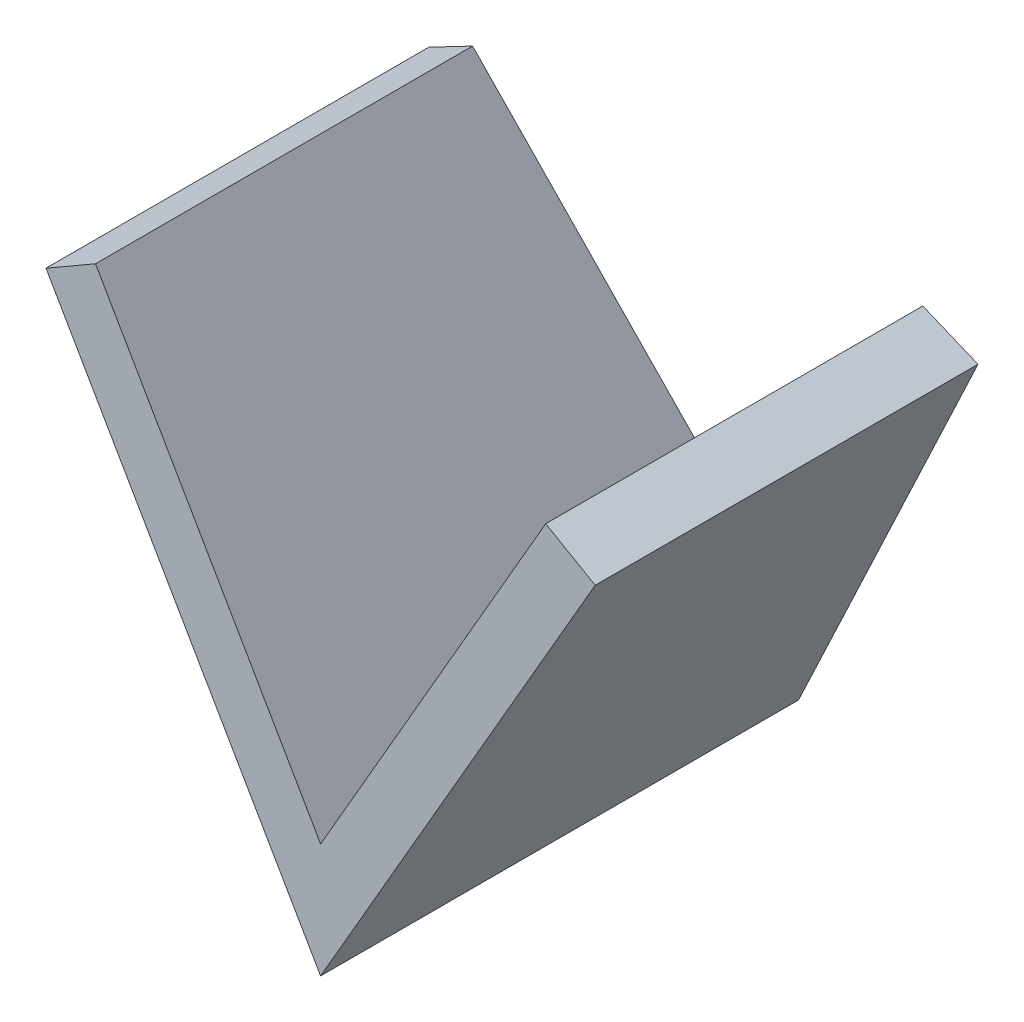
ISO-10303-21;
HEADER;
FILE_DESCRIPTION(('STEP AP214'),'2;1');
FILE_NAME('part.step','',(''),(''),'','','');
FILE_SCHEMA(('AUTOMOTIVE_DESIGN { 1 0 10303 214 1 1 1 1 }'));
ENDSEC;
DATA;
#1=APPLICATION_CONTEXT('core data for automotive mechanical design processes');
#2=APPLICATION_PROTOCOL_DEFINITION('international standard','automotive_design',2000,#1);
#3=PRODUCT_CONTEXT('',#1,'mechanical');
#4=PRODUCT('Part','Part','',(#3));
#5=PRODUCT_RELATED_PRODUCT_CATEGORY('part','',(#4));
#6=PRODUCT_DEFINITION_FORMATION('','',#4);
#7=PRODUCT_DEFINITION_CONTEXT('part definition',#1,'design');
#8=PRODUCT_DEFINITION('design','',#6,#7);
#9=PRODUCT_DEFINITION_SHAPE('','',#8);
#10=(LENGTH_UNIT() NAMED_UNIT(*) SI_UNIT(.MILLI.,.METRE.));
#11=(NAMED_UNIT(*) PLANE_ANGLE_UNIT() SI_UNIT($,.RADIAN.));
#12=(NAMED_UNIT(*) SI_UNIT($,.STERADIAN.) SOLID_ANGLE_UNIT());
#13=UNCERTAINTY_MEASURE_WITH_UNIT(LENGTH_MEASURE(1.E-05),#10,'distance_accuracy_value','');
#14=(GEOMETRIC_REPRESENTATION_CONTEXT(3) GLOBAL_UNCERTAINTY_ASSIGNED_CONTEXT((#13)) GLOBAL_UNIT_ASSIGNED_CONTEXT((#10,
#11,#12)) REPRESENTATION_CONTEXT('',''));
#15=CARTESIAN_POINT('',(0.,0.,0.));
#16=DIRECTION('',(0.,0.,1.));
#17=DIRECTION('',(1.,0.,0.));
#18=AXIS2_PLACEMENT_3D('',#15,#16,#17);
#19=CARTESIAN_POINT('',(-4.78858946785775E-13,-6.56272500000016,-12.5939415069886));
#20=DIRECTION('',(-0.866025403784497,-0.499999999999899,0.));
#21=DIRECTION('',(0.4999999999999,-0.866025403784497,0.));
#22=AXIS2_PLACEMENT_3D('',#19,#20,#21);
#23=PLANE('',#22);
#24=DIRECTION('',(-0.492664639082047,0.853320185982917,0.170664037196584));
#25=VECTOR('',#24,1.);
#26=CARTESIAN_POINT('',(0.630171919784603,-7.65421478257143,-5.31734295651449));
#27=LINE('',#26,#25);
#28=CARTESIAN_POINT('',(-4.78783679369599E-13,-6.56272500000016,-5.09904500000023));
#29=VERTEX_POINT('',#28);
#30=CARTESIAN_POINT('',(-2.92966802247208,-1.48839113576815,-4.08417822715383));
#31=VERTEX_POINT('',#30);
#32=EDGE_CURVE('E41',#29,#31,#27,.T.);
#33=ORIENTED_EDGE('',*,*,#32,.F.);
#34=DIRECTION('',(0.,0.,1.));
#35=VECTOR('',#34,1.);
#36=CARTESIAN_POINT('',(-4.78858946785775E-13,-6.56272500000016,-12.5939415069886));
#37=LINE('',#36,#35);
#38=CARTESIAN_POINT('',(-4.78858946785775E-13,-6.56272500000016,0.));
#39=VERTEX_POINT('',#38);
#40=EDGE_CURVE('E80',#29,#39,#37,.T.);
#41=ORIENTED_EDGE('',*,*,#40,.T.);
#42=DIRECTION('',(0.4999999999999,-0.866025403784497,0.));
#43=VECTOR('',#42,1.);
#44=CARTESIAN_POINT('',(-4.78858946785775E-13,-6.56272500000016,0.));
#45=LINE('',#44,#43);
#46=CARTESIAN_POINT('',(-2.92966802247208,-1.48839113576816,0.));
#47=VERTEX_POINT('',#46);
#48=EDGE_CURVE('E84',#47,#39,#45,.T.);
#49=ORIENTED_EDGE('',*,*,#48,.F.);
#50=DIRECTION('',(0.,0.,1.));
#51=VECTOR('',#50,1.);
#52=CARTESIAN_POINT('',(-2.92966802247208,-1.48839113576816,-12.5939415069886));
#53=LINE('',#52,#51);
#54=EDGE_CURVE('E114',#31,#47,#53,.T.);
#55=ORIENTED_EDGE('',*,*,#54,.F.);
#56=EDGE_LOOP('',(#33,#41,#49,#55));
#57=FACE_BOUND('',#56,.T.);
#58=ADVANCED_FACE('F33',(#57),#23,.T.);
#59=CARTESIAN_POINT('',(-2.92966802247208,-1.48839113576816,-12.5939415069886));
#60=DIRECTION('',(-0.500000000000007,0.866025403784435,0.));
#61=DIRECTION('',(-0.866025403784435,-0.500000000000007,0.));
#62=AXIS2_PLACEMENT_3D('',#59,#60,#61);
#63=PLANE('',#62);
#64=DIRECTION('',(0.861727484432135,0.497518595105002,0.0995037190209979));
#65=VECTOR('',#64,1.);
#66=CARTESIAN_POINT('',(-3.65933843638582,-1.90966654566097,-4.16843330913239));
#67=LINE('',#66,#65);
#68=CARTESIAN_POINT('',(-2.40173893632545,-1.18359113576836,-4.02321822715387));
#69=VERTEX_POINT('',#68);
#70=EDGE_CURVE('E136',#31,#69,#67,.T.);
#71=ORIENTED_EDGE('',*,*,#70,.F.);
#72=ORIENTED_EDGE('',*,*,#54,.T.);
#73=DIRECTION('',(-0.866025403784435,-0.500000000000007,0.));
#74=VECTOR('',#73,1.);
#75=CARTESIAN_POINT('',(-2.92966802247208,-1.48839113576816,0.));
#76=LINE('',#75,#74);
#77=CARTESIAN_POINT('',(-2.40173893632545,-1.18359113576836,0.));
#78=VERTEX_POINT('',#77);
#79=EDGE_CURVE('E90',#78,#47,#76,.T.);
#80=ORIENTED_EDGE('',*,*,#79,.F.);
#81=DIRECTION('',(0.,0.,1.));
#82=VECTOR('',#81,1.);
#83=CARTESIAN_POINT('',(-2.40173893632545,-1.18359113576836,-12.5939415069886));
#84=LINE('',#83,#82);
#85=EDGE_CURVE('E117',#69,#78,#84,.T.);
#86=ORIENTED_EDGE('',*,*,#85,.F.);
#87=EDGE_LOOP('',(#71,#72,#80,#86));
#88=FACE_BOUND('',#87,.T.);
#89=ADVANCED_FACE('F135',(#88),#63,.T.);
#90=CARTESIAN_POINT('',(-2.40173893632545,-1.18359113576836,-12.5939415069886));
#91=DIRECTION('',(0.866025403784461,0.499999999999962,0.));
#92=DIRECTION('',(-0.499999999999962,0.866025403784461,0.));
#93=AXIS2_PLACEMENT_3D('',#90,#91,#92);
#94=PLANE('',#93);
#95=DIRECTION('',(0.492664639082108,-0.853320185982883,-0.170664037196577));
#96=VECTOR('',#95,1.);
#97=CARTESIAN_POINT('',(-1.68111135485523,-2.43175472021038,-4.27285094404228));
#98=LINE('',#97,#96);
#99=CARTESIAN_POINT('',(3.45437654175607E-12,-5.34352500000687,-4.85520500000158));
#100=VERTEX_POINT('',#99);
#101=EDGE_CURVE('E139',#69,#100,#98,.T.);
#102=ORIENTED_EDGE('',*,*,#101,.F.);
#103=ORIENTED_EDGE('',*,*,#85,.T.);
#104=DIRECTION('',(-0.499999999999962,0.866025403784461,0.));
#105=VECTOR('',#104,1.);
#106=CARTESIAN_POINT('',(-2.40173893632545,-1.18359113576836,0.));
#107=LINE('',#106,#105);
#108=CARTESIAN_POINT('',(3.45450713704479E-12,-5.34352500000687,0.));
#109=VERTEX_POINT('',#108);
#110=EDGE_CURVE('E111',#109,#78,#107,.T.);
#111=ORIENTED_EDGE('',*,*,#110,.F.);
#112=DIRECTION('',(0.,0.,1.));
#113=VECTOR('',#112,1.);
#114=CARTESIAN_POINT('',(3.45450713704479E-12,-5.34352500000687,-12.5939415069886));
#115=LINE('',#114,#113);
#116=EDGE_CURVE('E119',#100,#109,#115,.T.);
#117=ORIENTED_EDGE('',*,*,#116,.F.);
#118=EDGE_LOOP('',(#102,#103,#111,#117));
#119=FACE_BOUND('',#118,.T.);
#120=ADVANCED_FACE('F143',(#119),#94,.T.);
#121=CARTESIAN_POINT('',(3.45450713704479E-12,-5.34352500000687,-12.5939415069886));
#122=DIRECTION('',(-0.866025403785136,0.499999999998792,0.));
#123=DIRECTION('',(-0.499999999998792,-0.866025403785136,0.));
#124=AXIS2_PLACEMENT_3D('',#121,#122,#123);
#125=PLANE('',#124);
#126=DIRECTION('',(0.492664639080945,0.853320185983529,0.170664037196704));
#127=VECTOR('',#126,1.);
#128=CARTESIAN_POINT('',(-0.650674020213407,-6.4705254621912,-5.08060509243844));
#129=LINE('',#128,#127);
#130=CARTESIAN_POINT('',(2.40173893632476,-1.18359113576854,-4.02321822715392));
#131=VERTEX_POINT('',#130);
#132=EDGE_CURVE('E48',#100,#131,#129,.T.);
#133=ORIENTED_EDGE('',*,*,#132,.F.);
#134=ORIENTED_EDGE('',*,*,#116,.T.);
#135=DIRECTION('',(-0.499999999998792,-0.866025403785136,0.));
#136=VECTOR('',#135,1.);
#137=CARTESIAN_POINT('',(3.45450713704479E-12,-5.34352500000687,0.));
#138=LINE('',#137,#136);
#139=CARTESIAN_POINT('',(2.40173893632476,-1.18359113576854,0.));
#140=VERTEX_POINT('',#139);
#141=EDGE_CURVE('E108',#140,#109,#138,.T.);
#142=ORIENTED_EDGE('',*,*,#141,.F.);
#143=DIRECTION('',(0.,0.,1.));
#144=VECTOR('',#143,1.);
#145=CARTESIAN_POINT('',(2.40173893632476,-1.18359113576854,-12.5939415069886));
#146=LINE('',#145,#144);
#147=EDGE_CURVE('E121',#131,#140,#146,.T.);
#148=ORIENTED_EDGE('',*,*,#147,.F.);
#149=EDGE_LOOP('',(#133,#134,#142,#148));
#150=FACE_BOUND('',#149,.T.);
#151=ADVANCED_FACE('F128',(#150),#125,.T.);
#152=CARTESIAN_POINT('',(2.40173893632476,-1.18359113576854,-12.5939415069886));
#153=DIRECTION('',(0.499999999999937,0.866025403784475,0.));
#154=DIRECTION('',(-0.866025403784475,0.499999999999937,0.));
#155=AXIS2_PLACEMENT_3D('',#152,#153,#154);
#156=PLANE('',#155);
#157=DIRECTION('',(0.861727484432176,-0.497518595104932,-0.0995037190209881));
#158=VECTOR('',#157,1.);
#159=CARTESIAN_POINT('',(3.13663637089338,-1.60788436744343,-4.1080768734889));
#160=LINE('',#159,#158);
#161=CARTESIAN_POINT('',(2.92966802247168,-1.48839113576844,-4.0841782271539));
#162=VERTEX_POINT('',#161);
#163=EDGE_CURVE('E116',#131,#162,#160,.T.);
#164=ORIENTED_EDGE('',*,*,#163,.F.);
#165=ORIENTED_EDGE('',*,*,#147,.T.);
#166=DIRECTION('',(-0.866025403784475,0.499999999999937,0.));
#167=VECTOR('',#166,1.);
#168=CARTESIAN_POINT('',(2.40173893632476,-1.18359113576854,0.));
#169=LINE('',#168,#167);
#170=CARTESIAN_POINT('',(2.92966802247168,-1.48839113576844,0.));
#171=VERTEX_POINT('',#170);
#172=EDGE_CURVE('E98',#171,#140,#169,.T.);
#173=ORIENTED_EDGE('',*,*,#172,.F.);
#174=DIRECTION('',(0.,0.,1.));
#175=VECTOR('',#174,1.);
#176=CARTESIAN_POINT('',(2.92966802247168,-1.48839113576844,-12.5939415069886));
#177=LINE('',#176,#175);
#178=EDGE_CURVE('E89',#162,#171,#177,.T.);
#179=ORIENTED_EDGE('',*,*,#178,.F.);
#180=EDGE_LOOP('',(#164,#165,#173,#179));
#181=FACE_BOUND('',#180,.T.);
#182=ADVANCED_FACE('F126',(#181),#156,.T.);
#183=CARTESIAN_POINT('',(2.92966802247168,-1.48839113576844,-12.5939415069886));
#184=DIRECTION('',(0.866025403784443,-0.499999999999992,0.));
#185=DIRECTION('',(0.499999999999992,0.866025403784443,0.));
#186=AXIS2_PLACEMENT_3D('',#183,#184,#185);
#187=PLANE('',#186);
#188=DIRECTION('',(-0.492664639082139,-0.853320185982866,-0.170664037196571));
#189=VECTOR('',#188,1.);
#190=CARTESIAN_POINT('',(2.21416596610966,-2.72767705030748,-4.33203541006171));
#191=LINE('',#190,#189);
#192=EDGE_CURVE('E11',#162,#29,#191,.T.);
#193=ORIENTED_EDGE('',*,*,#192,.F.);
#194=ORIENTED_EDGE('',*,*,#178,.T.);
#195=DIRECTION('',(0.499999999999992,0.866025403784443,0.));
#196=VECTOR('',#195,1.);
#197=CARTESIAN_POINT('',(2.92966802247168,-1.48839113576844,0.));
#198=LINE('',#197,#196);
#199=EDGE_CURVE('E92',#39,#171,#198,.T.);
#200=ORIENTED_EDGE('',*,*,#199,.F.);
#201=ORIENTED_EDGE('',*,*,#40,.F.);
#202=EDGE_LOOP('',(#193,#194,#200,#201));
#203=FACE_BOUND('',#202,.T.);
#204=ADVANCED_FACE('F93',(#203),#187,.T.);
#205=CARTESIAN_POINT('',(0.,0.,0.));
#206=DIRECTION('',(0.,0.,-1.));
#207=DIRECTION('',(-1.,0.,0.));
#208=AXIS2_PLACEMENT_3D('',#205,#206,#207);
#209=PLANE('',#208);
#210=ORIENTED_EDGE('',*,*,#48,.T.);
#211=ORIENTED_EDGE('',*,*,#199,.T.);
#212=ORIENTED_EDGE('',*,*,#172,.T.);
#213=ORIENTED_EDGE('',*,*,#141,.T.);
#214=ORIENTED_EDGE('',*,*,#110,.T.);
#215=ORIENTED_EDGE('',*,*,#79,.T.);
#216=EDGE_LOOP('',(#210,#211,#212,#213,#214,#215));
#217=FACE_BOUND('',#216,.T.);
#218=ADVANCED_FACE('F100',(#217),#209,.F.);
#219=CARTESIAN_POINT('',(5.07999999999957,-7.93750000000006,-5.37400000000022));
#220=DIRECTION('',(0.,-0.196116135138183,0.98058067569092));
#221=DIRECTION('',(0.,0.980580675690921,0.196116135138183));
#222=AXIS2_PLACEMENT_3D('',#219,#220,#221);
#223=PLANE('',#222);
#224=ORIENTED_EDGE('',*,*,#32,.T.);
#225=ORIENTED_EDGE('',*,*,#70,.T.);
#226=ORIENTED_EDGE('',*,*,#101,.T.);
#227=ORIENTED_EDGE('',*,*,#132,.T.);
#228=ORIENTED_EDGE('',*,*,#163,.T.);
#229=ORIENTED_EDGE('',*,*,#192,.T.);
#230=EDGE_LOOP('',(#224,#225,#226,#227,#228,#229));
#231=FACE_BOUND('',#230,.T.);
#232=ADVANCED_FACE('F137',(#231),#223,.F.);
#233=CLOSED_SHELL('',(#58,#89,#120,#151,#182,#204,#218,#232));
#234=MANIFOLD_SOLID_BREP('B2',#233);
#235=ADVANCED_BREP_SHAPE_REPRESENTATION('',(#18,#234),#14);
#236=SHAPE_DEFINITION_REPRESENTATION(#9,#235);
ENDSEC;
END-ISO-10303-21;
